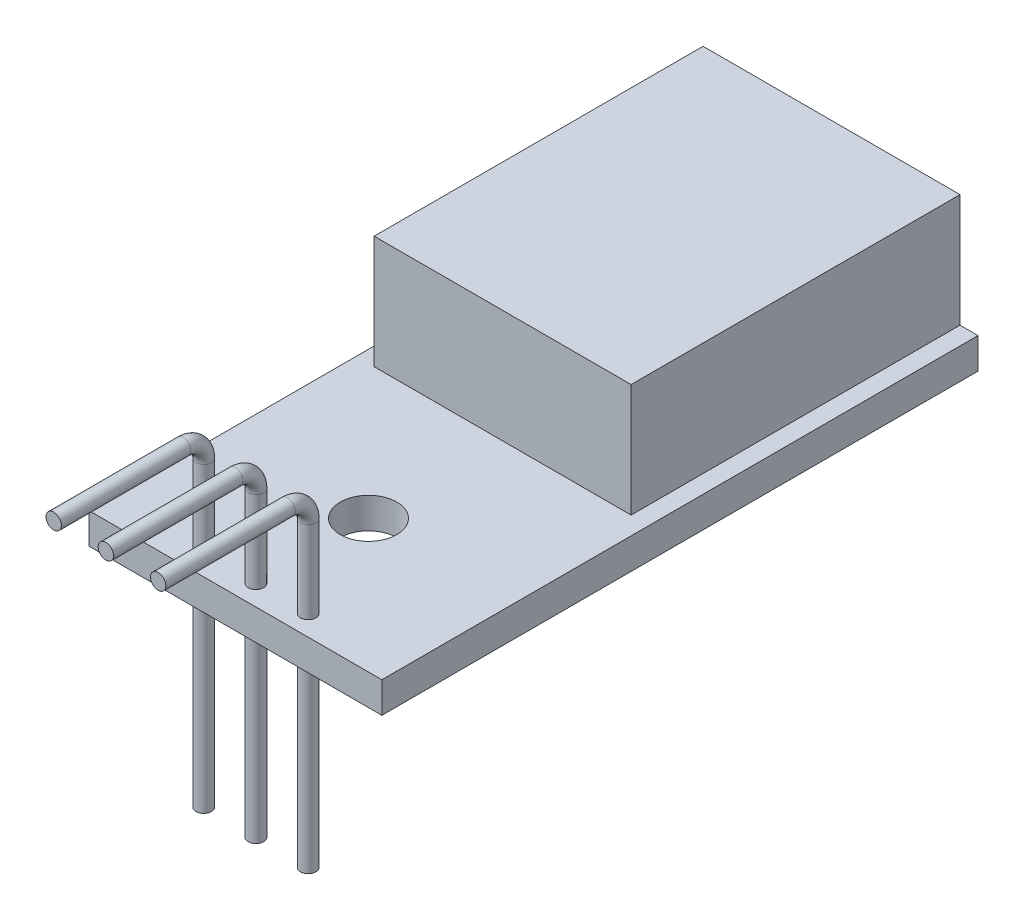
ISO-10303-21;
HEADER;
FILE_DESCRIPTION(('STEP AP214'),'2;1');
FILE_NAME('part.step','',(''),(''),'','','');
FILE_SCHEMA(('AUTOMOTIVE_DESIGN { 1 0 10303 214 1 1 1 1 }'));
ENDSEC;
DATA;
#1=APPLICATION_CONTEXT('core data for automotive mechanical design processes');
#2=APPLICATION_PROTOCOL_DEFINITION('international standard','automotive_design',2000,#1);
#3=PRODUCT_CONTEXT('',#1,'mechanical');
#4=PRODUCT('Part','Part','',(#3));
#5=PRODUCT_RELATED_PRODUCT_CATEGORY('part','',(#4));
#6=PRODUCT_DEFINITION_FORMATION('','',#4);
#7=PRODUCT_DEFINITION_CONTEXT('part definition',#1,'design');
#8=PRODUCT_DEFINITION('design','',#6,#7);
#9=PRODUCT_DEFINITION_SHAPE('','',#8);
#10=(LENGTH_UNIT() NAMED_UNIT(*) SI_UNIT(.MILLI.,.METRE.));
#11=(NAMED_UNIT(*) PLANE_ANGLE_UNIT() SI_UNIT($,.RADIAN.));
#12=(NAMED_UNIT(*) SI_UNIT($,.STERADIAN.) SOLID_ANGLE_UNIT());
#13=UNCERTAINTY_MEASURE_WITH_UNIT(LENGTH_MEASURE(1.E-05),#10,'distance_accuracy_value','');
#14=(GEOMETRIC_REPRESENTATION_CONTEXT(3) GLOBAL_UNCERTAINTY_ASSIGNED_CONTEXT((#13)) GLOBAL_UNIT_ASSIGNED_CONTEXT((#10,
#11,#12)) REPRESENTATION_CONTEXT('',''));
#15=CARTESIAN_POINT('',(0.,0.,0.));
#16=DIRECTION('',(0.,0.,1.));
#17=DIRECTION('',(1.,0.,0.));
#18=AXIS2_PLACEMENT_3D('',#15,#16,#17);
#19=CARTESIAN_POINT('',(0.,1.5,0.));
#20=DIRECTION('',(0.,-1.,0.));
#21=DIRECTION('',(0.,0.,-1.));
#22=AXIS2_PLACEMENT_3D('',#19,#20,#21);
#23=PLANE('',#22);
#24=CARTESIAN_POINT('',(-2.54,1.5,13.5));
#25=DIRECTION('',(0.,-1.,0.));
#26=DIRECTION('',(0.,0.,-1.));
#27=AXIS2_PLACEMENT_3D('',#24,#25,#26);
#28=CIRCLE('',#27,0.375);
#29=CARTESIAN_POINT('',(-2.54,1.5,13.125));
#30=VERTEX_POINT('',#29);
#31=EDGE_CURVE('E333',#30,#30,#28,.T.);
#32=ORIENTED_EDGE('',*,*,#31,.T.);
#33=EDGE_LOOP('',(#32));
#34=FACE_BOUND('',#33,.T.);
#35=CARTESIAN_POINT('',(2.54,1.5,13.5));
#36=DIRECTION('',(0.,-1.,0.));
#37=DIRECTION('',(0.,0.,-1.));
#38=AXIS2_PLACEMENT_3D('',#35,#36,#37);
#39=CIRCLE('',#38,0.375);
#40=CARTESIAN_POINT('',(2.54,1.5,13.125));
#41=VERTEX_POINT('',#40);
#42=EDGE_CURVE('E255',#41,#41,#39,.T.);
#43=ORIENTED_EDGE('',*,*,#42,.T.);
#44=EDGE_LOOP('',(#43));
#45=FACE_BOUND('',#44,.T.);
#46=CARTESIAN_POINT('',(0.,1.5,13.5));
#47=DIRECTION('',(0.,-1.,0.));
#48=DIRECTION('',(0.,0.,-1.));
#49=AXIS2_PLACEMENT_3D('',#46,#47,#48);
#50=CIRCLE('',#49,0.375);
#51=CARTESIAN_POINT('',(0.,1.5,13.125));
#52=VERTEX_POINT('',#51);
#53=EDGE_CURVE('E135',#52,#52,#50,.T.);
#54=ORIENTED_EDGE('',*,*,#53,.T.);
#55=EDGE_LOOP('',(#54));
#56=FACE_BOUND('',#55,.T.);
#57=CARTESIAN_POINT('',(0.,1.5,8.02500000000001));
#58=DIRECTION('',(0.,1.,0.));
#59=DIRECTION('',(0.,0.,1.));
#60=AXIS2_PLACEMENT_3D('',#57,#58,#59);
#61=CIRCLE('',#60,1.375);
#62=CARTESIAN_POINT('',(0.,1.5,9.40000000000001));
#63=VERTEX_POINT('',#62);
#64=EDGE_CURVE('E124',#63,#63,#61,.T.);
#65=ORIENTED_EDGE('',*,*,#64,.F.);
#66=EDGE_LOOP('',(#65));
#67=FACE_BOUND('',#66,.T.);
#68=DIRECTION('',(0.,0.,-1.));
#69=VECTOR('',#68,1.);
#70=CARTESIAN_POINT('',(6.25,1.5,1.5));
#71=LINE('',#70,#69);
#72=CARTESIAN_POINT('',(6.25,1.5,1.5));
#73=VERTEX_POINT('',#72);
#74=CARTESIAN_POINT('',(6.25,1.5,-14.5));
#75=VERTEX_POINT('',#74);
#76=EDGE_CURVE('E50',#73,#75,#71,.T.);
#77=ORIENTED_EDGE('',*,*,#76,.F.);
#78=DIRECTION('',(1.,0.,0.));
#79=VECTOR('',#78,1.);
#80=CARTESIAN_POINT('',(-6.25,1.5,1.5));
#81=LINE('',#80,#79);
#82=CARTESIAN_POINT('',(-6.25,1.5,1.5));
#83=VERTEX_POINT('',#82);
#84=EDGE_CURVE('E118',#83,#73,#81,.T.);
#85=ORIENTED_EDGE('',*,*,#84,.F.);
#86=DIRECTION('',(0.,0.,1.));
#87=VECTOR('',#86,1.);
#88=CARTESIAN_POINT('',(-6.25,1.5,1.5));
#89=LINE('',#88,#87);
#90=CARTESIAN_POINT('',(-6.25,1.5,-14.5));
#91=VERTEX_POINT('',#90);
#92=EDGE_CURVE('E56',#91,#83,#89,.T.);
#93=ORIENTED_EDGE('',*,*,#92,.F.);
#94=DIRECTION('',(-1.,0.,0.));
#95=VECTOR('',#94,1.);
#96=CARTESIAN_POINT('',(-7.125,1.5,-14.5));
#97=LINE('',#96,#95);
#98=CARTESIAN_POINT('',(-7.125,1.5,-14.5));
#99=VERTEX_POINT('',#98);
#100=EDGE_CURVE('E153',#91,#99,#97,.T.);
#101=ORIENTED_EDGE('',*,*,#100,.T.);
#102=DIRECTION('',(0.,0.,1.));
#103=VECTOR('',#102,1.);
#104=CARTESIAN_POINT('',(-7.125,1.5,14.5));
#105=LINE('',#104,#103);
#106=CARTESIAN_POINT('',(-7.125,1.5,14.5));
#107=VERTEX_POINT('',#106);
#108=EDGE_CURVE('E157',#99,#107,#105,.T.);
#109=ORIENTED_EDGE('',*,*,#108,.T.);
#110=DIRECTION('',(1.,0.,0.));
#111=VECTOR('',#110,1.);
#112=CARTESIAN_POINT('',(-7.125,1.5,14.5));
#113=LINE('',#112,#111);
#114=CARTESIAN_POINT('',(7.125,1.5,14.5));
#115=VERTEX_POINT('',#114);
#116=EDGE_CURVE('E177',#107,#115,#113,.T.);
#117=ORIENTED_EDGE('',*,*,#116,.T.);
#118=DIRECTION('',(0.,0.,-1.));
#119=VECTOR('',#118,1.);
#120=CARTESIAN_POINT('',(7.125,1.5,14.5));
#121=LINE('',#120,#119);
#122=CARTESIAN_POINT('',(7.125,1.5,-14.5));
#123=VERTEX_POINT('',#122);
#124=EDGE_CURVE('E150',#115,#123,#121,.T.);
#125=ORIENTED_EDGE('',*,*,#124,.T.);
#126=EDGE_CURVE('E163',#123,#75,#97,.T.);
#127=ORIENTED_EDGE('',*,*,#126,.T.);
#128=EDGE_LOOP('',(#77,#85,#93,#101,#109,#117,#125,#127));
#129=FACE_BOUND('',#128,.T.);
#130=ADVANCED_FACE('F33',(#34,#45,#56,#67,#129),#23,.F.);
#131=CARTESIAN_POINT('',(0.,0.,0.));
#132=DIRECTION('',(0.,-1.,0.));
#133=DIRECTION('',(0.,0.,-1.));
#134=AXIS2_PLACEMENT_3D('',#131,#132,#133);
#135=PLANE('',#134);
#136=CARTESIAN_POINT('',(-2.54,0.,13.5));
#137=DIRECTION('',(0.,-1.,0.));
#138=DIRECTION('',(0.,0.,-1.));
#139=AXIS2_PLACEMENT_3D('',#136,#137,#138);
#140=CIRCLE('',#139,0.375);
#141=CARTESIAN_POINT('',(-2.54,0.,13.125));
#142=VERTEX_POINT('',#141);
#143=EDGE_CURVE('E12',#142,#142,#140,.T.);
#144=ORIENTED_EDGE('',*,*,#143,.F.);
#145=EDGE_LOOP('',(#144));
#146=FACE_BOUND('',#145,.T.);
#147=CARTESIAN_POINT('',(2.54,0.,13.5));
#148=DIRECTION('',(0.,-1.,0.));
#149=DIRECTION('',(0.,0.,-1.));
#150=AXIS2_PLACEMENT_3D('',#147,#148,#149);
#151=CIRCLE('',#150,0.375);
#152=CARTESIAN_POINT('',(2.54,0.,13.125));
#153=VERTEX_POINT('',#152);
#154=EDGE_CURVE('E42',#153,#153,#151,.T.);
#155=ORIENTED_EDGE('',*,*,#154,.F.);
#156=EDGE_LOOP('',(#155));
#157=FACE_BOUND('',#156,.T.);
#158=CARTESIAN_POINT('',(0.,0.,13.5));
#159=DIRECTION('',(0.,-1.,0.));
#160=DIRECTION('',(0.,0.,-1.));
#161=AXIS2_PLACEMENT_3D('',#158,#159,#160);
#162=CIRCLE('',#161,0.375);
#163=CARTESIAN_POINT('',(0.,0.,13.125));
#164=VERTEX_POINT('',#163);
#165=EDGE_CURVE('E136',#164,#164,#162,.T.);
#166=ORIENTED_EDGE('',*,*,#165,.F.);
#167=EDGE_LOOP('',(#166));
#168=FACE_BOUND('',#167,.T.);
#169=DIRECTION('',(0.,0.,-1.));
#170=VECTOR('',#169,1.);
#171=CARTESIAN_POINT('',(7.125,0.,14.5));
#172=LINE('',#171,#170);
#173=CARTESIAN_POINT('',(7.125,0.,14.5));
#174=VERTEX_POINT('',#173);
#175=CARTESIAN_POINT('',(7.125,0.,-14.5));
#176=VERTEX_POINT('',#175);
#177=EDGE_CURVE('E148',#174,#176,#172,.T.);
#178=ORIENTED_EDGE('',*,*,#177,.F.);
#179=DIRECTION('',(1.,0.,0.));
#180=VECTOR('',#179,1.);
#181=CARTESIAN_POINT('',(-7.125,0.,14.5));
#182=LINE('',#181,#180);
#183=CARTESIAN_POINT('',(-7.125,0.,14.5));
#184=VERTEX_POINT('',#183);
#185=EDGE_CURVE('E154',#184,#174,#182,.T.);
#186=ORIENTED_EDGE('',*,*,#185,.F.);
#187=DIRECTION('',(0.,0.,1.));
#188=VECTOR('',#187,1.);
#189=CARTESIAN_POINT('',(-7.125,0.,14.5));
#190=LINE('',#189,#188);
#191=CARTESIAN_POINT('',(-7.125,0.,-14.5));
#192=VERTEX_POINT('',#191);
#193=EDGE_CURVE('E179',#192,#184,#190,.T.);
#194=ORIENTED_EDGE('',*,*,#193,.F.);
#195=DIRECTION('',(-1.,0.,0.));
#196=VECTOR('',#195,1.);
#197=CARTESIAN_POINT('',(-7.125,0.,-14.5));
#198=LINE('',#197,#196);
#199=EDGE_CURVE('E181',#176,#192,#198,.T.);
#200=ORIENTED_EDGE('',*,*,#199,.F.);
#201=EDGE_LOOP('',(#178,#186,#194,#200));
#202=FACE_BOUND('',#201,.T.);
#203=CARTESIAN_POINT('',(0.,0.,8.02500000000001));
#204=DIRECTION('',(0.,1.,0.));
#205=DIRECTION('',(0.,0.,1.));
#206=AXIS2_PLACEMENT_3D('',#203,#204,#205);
#207=CIRCLE('',#206,1.375);
#208=CARTESIAN_POINT('',(0.,0.,9.40000000000001));
#209=VERTEX_POINT('',#208);
#210=EDGE_CURVE('E121',#209,#209,#207,.T.);
#211=ORIENTED_EDGE('',*,*,#210,.T.);
#212=EDGE_LOOP('',(#211));
#213=FACE_BOUND('',#212,.T.);
#214=ADVANCED_FACE('F201',(#146,#157,#168,#202,#213),#135,.T.);
#215=CARTESIAN_POINT('',(7.125,1.5,14.5));
#216=DIRECTION('',(-1.,0.,0.));
#217=DIRECTION('',(0.,0.,1.));
#218=AXIS2_PLACEMENT_3D('',#215,#216,#217);
#219=PLANE('',#218);
#220=ORIENTED_EDGE('',*,*,#177,.T.);
#221=DIRECTION('',(0.,-1.,0.));
#222=VECTOR('',#221,1.);
#223=CARTESIAN_POINT('',(7.125,1.5,-14.5));
#224=LINE('',#223,#222);
#225=EDGE_CURVE('E165',#123,#176,#224,.T.);
#226=ORIENTED_EDGE('',*,*,#225,.F.);
#227=ORIENTED_EDGE('',*,*,#124,.F.);
#228=DIRECTION('',(0.,-1.,0.));
#229=VECTOR('',#228,1.);
#230=CARTESIAN_POINT('',(7.125,1.5,14.5));
#231=LINE('',#230,#229);
#232=EDGE_CURVE('E174',#115,#174,#231,.T.);
#233=ORIENTED_EDGE('',*,*,#232,.T.);
#234=EDGE_LOOP('',(#220,#226,#227,#233));
#235=FACE_BOUND('',#234,.T.);
#236=ADVANCED_FACE('F199',(#235),#219,.F.);
#237=CARTESIAN_POINT('',(-7.125,1.5,-14.5));
#238=DIRECTION('',(0.,0.,1.));
#239=DIRECTION('',(1.,0.,0.));
#240=AXIS2_PLACEMENT_3D('',#237,#238,#239);
#241=PLANE('',#240);
#242=ORIENTED_EDGE('',*,*,#199,.T.);
#243=DIRECTION('',(0.,-1.,0.));
#244=VECTOR('',#243,1.);
#245=CARTESIAN_POINT('',(-7.125,1.5,-14.5));
#246=LINE('',#245,#244);
#247=EDGE_CURVE('E168',#99,#192,#246,.T.);
#248=ORIENTED_EDGE('',*,*,#247,.F.);
#249=ORIENTED_EDGE('',*,*,#100,.F.);
#250=DIRECTION('',(0.,-1.,0.));
#251=VECTOR('',#250,1.);
#252=CARTESIAN_POINT('',(-6.25,7.,-14.5));
#253=LINE('',#252,#251);
#254=CARTESIAN_POINT('',(-6.25,7.,-14.5));
#255=VERTEX_POINT('',#254);
#256=EDGE_CURVE('E105',#255,#91,#253,.T.);
#257=ORIENTED_EDGE('',*,*,#256,.F.);
#258=DIRECTION('',(-1.,0.,0.));
#259=VECTOR('',#258,1.);
#260=CARTESIAN_POINT('',(-6.25,7.,-14.5));
#261=LINE('',#260,#259);
#262=CARTESIAN_POINT('',(6.25,7.,-14.5));
#263=VERTEX_POINT('',#262);
#264=EDGE_CURVE('E99',#263,#255,#261,.T.);
#265=ORIENTED_EDGE('',*,*,#264,.F.);
#266=DIRECTION('',(0.,-1.,0.));
#267=VECTOR('',#266,1.);
#268=CARTESIAN_POINT('',(6.25,7.,-14.5));
#269=LINE('',#268,#267);
#270=EDGE_CURVE('E103',#263,#75,#269,.T.);
#271=ORIENTED_EDGE('',*,*,#270,.T.);
#272=ORIENTED_EDGE('',*,*,#126,.F.);
#273=ORIENTED_EDGE('',*,*,#225,.T.);
#274=EDGE_LOOP('',(#242,#248,#249,#257,#265,#271,#272,#273));
#275=FACE_BOUND('',#274,.T.);
#276=ADVANCED_FACE('F101',(#275),#241,.F.);
#277=CARTESIAN_POINT('',(-7.125,1.5,14.5));
#278=DIRECTION('',(1.,0.,0.));
#279=DIRECTION('',(0.,0.,-1.));
#280=AXIS2_PLACEMENT_3D('',#277,#278,#279);
#281=PLANE('',#280);
#282=ORIENTED_EDGE('',*,*,#193,.T.);
#283=DIRECTION('',(0.,-1.,0.));
#284=VECTOR('',#283,1.);
#285=CARTESIAN_POINT('',(-7.125,1.5,14.5));
#286=LINE('',#285,#284);
#287=EDGE_CURVE('E171',#107,#184,#286,.T.);
#288=ORIENTED_EDGE('',*,*,#287,.F.);
#289=ORIENTED_EDGE('',*,*,#108,.F.);
#290=ORIENTED_EDGE('',*,*,#247,.T.);
#291=EDGE_LOOP('',(#282,#288,#289,#290));
#292=FACE_BOUND('',#291,.T.);
#293=ADVANCED_FACE('F190',(#292),#281,.F.);
#294=CARTESIAN_POINT('',(-7.125,1.5,14.5));
#295=DIRECTION('',(0.,0.,-1.));
#296=DIRECTION('',(-1.,0.,0.));
#297=AXIS2_PLACEMENT_3D('',#294,#295,#296);
#298=PLANE('',#297);
#299=ORIENTED_EDGE('',*,*,#185,.T.);
#300=ORIENTED_EDGE('',*,*,#232,.F.);
#301=ORIENTED_EDGE('',*,*,#116,.F.);
#302=ORIENTED_EDGE('',*,*,#287,.T.);
#303=EDGE_LOOP('',(#299,#300,#301,#302));
#304=FACE_BOUND('',#303,.T.);
#305=ADVANCED_FACE('F194',(#304),#298,.F.);
#306=CARTESIAN_POINT('',(0.,1.5,8.02500000000001));
#307=DIRECTION('',(0.,-1.,0.));
#308=DIRECTION('',(0.,0.,-1.));
#309=AXIS2_PLACEMENT_3D('',#306,#307,#308);
#310=CYLINDRICAL_SURFACE('',#309,1.375);
#311=ORIENTED_EDGE('',*,*,#64,.T.);
#312=EDGE_LOOP('',(#311));
#313=FACE_BOUND('',#312,.T.);
#314=ORIENTED_EDGE('',*,*,#210,.F.);
#315=EDGE_LOOP('',(#314));
#316=FACE_BOUND('',#315,.T.);
#317=ADVANCED_FACE('F208',(#313,#316),#310,.F.);
#318=CARTESIAN_POINT('',(6.25,7.,1.5));
#319=DIRECTION('',(-1.,0.,0.));
#320=DIRECTION('',(0.,0.,1.));
#321=AXIS2_PLACEMENT_3D('',#318,#319,#320);
#322=PLANE('',#321);
#323=ORIENTED_EDGE('',*,*,#76,.T.);
#324=ORIENTED_EDGE('',*,*,#270,.F.);
#325=DIRECTION('',(0.,0.,-1.));
#326=VECTOR('',#325,1.);
#327=CARTESIAN_POINT('',(6.25,7.,1.5));
#328=LINE('',#327,#326);
#329=CARTESIAN_POINT('',(6.25,7.,1.5));
#330=VERTEX_POINT('',#329);
#331=EDGE_CURVE('E109',#330,#263,#328,.T.);
#332=ORIENTED_EDGE('',*,*,#331,.F.);
#333=DIRECTION('',(0.,-1.,0.));
#334=VECTOR('',#333,1.);
#335=CARTESIAN_POINT('',(6.25,7.,1.5));
#336=LINE('',#335,#334);
#337=EDGE_CURVE('E143',#330,#73,#336,.T.);
#338=ORIENTED_EDGE('',*,*,#337,.T.);
#339=EDGE_LOOP('',(#323,#324,#332,#338));
#340=FACE_BOUND('',#339,.T.);
#341=ADVANCED_FACE('F120',(#340),#322,.F.);
#342=CARTESIAN_POINT('',(-6.25,7.,1.5));
#343=DIRECTION('',(1.,0.,0.));
#344=DIRECTION('',(0.,0.,-1.));
#345=AXIS2_PLACEMENT_3D('',#342,#343,#344);
#346=PLANE('',#345);
#347=ORIENTED_EDGE('',*,*,#92,.T.);
#348=DIRECTION('',(0.,-1.,0.));
#349=VECTOR('',#348,1.);
#350=CARTESIAN_POINT('',(-6.25,7.,1.5));
#351=LINE('',#350,#349);
#352=CARTESIAN_POINT('',(-6.25,7.,1.5));
#353=VERTEX_POINT('',#352);
#354=EDGE_CURVE('E126',#353,#83,#351,.T.);
#355=ORIENTED_EDGE('',*,*,#354,.F.);
#356=DIRECTION('',(0.,0.,1.));
#357=VECTOR('',#356,1.);
#358=CARTESIAN_POINT('',(-6.25,7.,1.5));
#359=LINE('',#358,#357);
#360=EDGE_CURVE('E108',#255,#353,#359,.T.);
#361=ORIENTED_EDGE('',*,*,#360,.F.);
#362=ORIENTED_EDGE('',*,*,#256,.T.);
#363=EDGE_LOOP('',(#347,#355,#361,#362));
#364=FACE_BOUND('',#363,.T.);
#365=ADVANCED_FACE('F216',(#364),#346,.F.);
#366=CARTESIAN_POINT('',(-6.25,7.,1.5));
#367=DIRECTION('',(0.,0.,-1.));
#368=DIRECTION('',(-1.,0.,0.));
#369=AXIS2_PLACEMENT_3D('',#366,#367,#368);
#370=PLANE('',#369);
#371=ORIENTED_EDGE('',*,*,#84,.T.);
#372=ORIENTED_EDGE('',*,*,#337,.F.);
#373=DIRECTION('',(1.,0.,0.));
#374=VECTOR('',#373,1.);
#375=CARTESIAN_POINT('',(-6.25,7.,1.5));
#376=LINE('',#375,#374);
#377=EDGE_CURVE('E114',#353,#330,#376,.T.);
#378=ORIENTED_EDGE('',*,*,#377,.F.);
#379=ORIENTED_EDGE('',*,*,#354,.T.);
#380=EDGE_LOOP('',(#371,#372,#378,#379));
#381=FACE_BOUND('',#380,.T.);
#382=ADVANCED_FACE('F249',(#381),#370,.F.);
#383=CARTESIAN_POINT('',(0.,7.,0.));
#384=DIRECTION('',(0.,-1.,0.));
#385=DIRECTION('',(0.,0.,-1.));
#386=AXIS2_PLACEMENT_3D('',#383,#384,#385);
#387=PLANE('',#386);
#388=ORIENTED_EDGE('',*,*,#331,.T.);
#389=ORIENTED_EDGE('',*,*,#264,.T.);
#390=ORIENTED_EDGE('',*,*,#360,.T.);
#391=ORIENTED_EDGE('',*,*,#377,.T.);
#392=EDGE_LOOP('',(#388,#389,#390,#391));
#393=FACE_BOUND('',#392,.T.);
#394=ADVANCED_FACE('F112',(#393),#387,.F.);
#395=CARTESIAN_POINT('',(0.,-9.2,13.5));
#396=DIRECTION('',(0.,-1.,0.));
#397=DIRECTION('',(0.,0.,-1.));
#398=AXIS2_PLACEMENT_3D('',#395,#396,#397);
#399=PLANE('',#398);
#400=CARTESIAN_POINT('',(0.,-9.2,13.5));
#401=DIRECTION('',(0.,-1.,0.));
#402=DIRECTION('',(0.,0.,-1.));
#403=AXIS2_PLACEMENT_3D('',#400,#401,#402);
#404=CIRCLE('',#403,0.375);
#405=CARTESIAN_POINT('',(0.,-9.2,13.125));
#406=VERTEX_POINT('',#405);
#407=EDGE_CURVE('E37',#406,#406,#404,.T.);
#408=ORIENTED_EDGE('',*,*,#407,.T.);
#409=EDGE_LOOP('',(#408));
#410=FACE_BOUND('',#409,.T.);
#411=ADVANCED_FACE('F238',(#410),#399,.T.);
#412=CARTESIAN_POINT('',(0.,5.5,13.5));
#413=DIRECTION('',(0.,-1.,0.));
#414=DIRECTION('',(0.,0.,-1.));
#415=AXIS2_PLACEMENT_3D('',#412,#413,#414);
#416=CYLINDRICAL_SURFACE('',#415,0.375);
#417=ORIENTED_EDGE('',*,*,#165,.T.);
#418=EDGE_LOOP('',(#417));
#419=FACE_BOUND('',#418,.T.);
#420=ORIENTED_EDGE('',*,*,#407,.F.);
#421=EDGE_LOOP('',(#420));
#422=FACE_BOUND('',#421,.T.);
#423=ADVANCED_FACE('F240',(#419,#422),#416,.T.);
#424=CARTESIAN_POINT('',(0.,5.5,13.5));
#425=DIRECTION('',(0.,-1.,0.));
#426=DIRECTION('',(0.,0.,-1.));
#427=AXIS2_PLACEMENT_3D('',#424,#425,#426);
#428=CIRCLE('',#427,0.375);
#429=CARTESIAN_POINT('',(0.,5.5,13.125));
#430=VERTEX_POINT('',#429);
#431=EDGE_CURVE('E254',#430,#430,#428,.T.);
#432=ORIENTED_EDGE('',*,*,#431,.T.);
#433=EDGE_LOOP('',(#432));
#434=FACE_BOUND('',#433,.T.);
#435=ORIENTED_EDGE('',*,*,#53,.F.);
#436=EDGE_LOOP('',(#435));
#437=FACE_BOUND('',#436,.T.);
#438=ADVANCED_FACE('F246',(#434,#437),#416,.T.);
#439=CARTESIAN_POINT('',(0.,6.5,14.5));
#440=DIRECTION('',(0.,0.,1.));
#441=DIRECTION('',(0.,-1.,0.));
#442=AXIS2_PLACEMENT_3D('',#439,#440,#441);
#443=CYLINDRICAL_SURFACE('',#442,0.375);
#444=CARTESIAN_POINT('',(0.,6.5,14.5));
#445=DIRECTION('',(0.,0.,-1.));
#446=DIRECTION('',(0.,1.,0.));
#447=AXIS2_PLACEMENT_3D('',#444,#445,#446);
#448=CIRCLE('',#447,0.375);
#449=CARTESIAN_POINT('',(0.,6.875,14.5));
#450=VERTEX_POINT('',#449);
#451=EDGE_CURVE('E257',#450,#450,#448,.T.);
#452=ORIENTED_EDGE('',*,*,#451,.F.);
#453=EDGE_LOOP('',(#452));
#454=FACE_BOUND('',#453,.T.);
#455=CARTESIAN_POINT('',(0.,6.5,20.8));
#456=DIRECTION('',(0.,0.,-1.));
#457=DIRECTION('',(0.,1.,0.));
#458=AXIS2_PLACEMENT_3D('',#455,#456,#457);
#459=CIRCLE('',#458,0.375);
#460=CARTESIAN_POINT('',(0.,6.875,20.8));
#461=VERTEX_POINT('',#460);
#462=EDGE_CURVE('E270',#461,#461,#459,.T.);
#463=ORIENTED_EDGE('',*,*,#462,.T.);
#464=EDGE_LOOP('',(#463));
#465=FACE_BOUND('',#464,.T.);
#466=ADVANCED_FACE('F284',(#454,#465),#443,.T.);
#467=CARTESIAN_POINT('',(0.,5.5,14.5));
#468=DIRECTION('',(1.,0.,0.));
#469=DIRECTION('',(0.,0.,-1.));
#470=AXIS2_PLACEMENT_3D('',#467,#468,#469);
#471=TOROIDAL_SURFACE('',#470,1.,0.375);
#472=CARTESIAN_POINT('',(0.,5.5,14.5));
#473=DIRECTION('',(1.,0.,0.));
#474=DIRECTION('',(0.,0.,-1.));
#475=AXIS2_PLACEMENT_3D('',#472,#473,#474);
#476=CIRCLE('',#475,1.375);
#477=EDGE_CURVE('',#430,#450,#476,.T.);
#478=ORIENTED_EDGE('',*,*,#431,.F.);
#479=ORIENTED_EDGE('',*,*,#451,.T.);
#480=ORIENTED_EDGE('',*,*,#477,.T.);
#481=ORIENTED_EDGE('',*,*,#477,.F.);
#482=EDGE_LOOP('',(#478,#480,#479,#481));
#483=FACE_BOUND('',#482,.T.);
#484=ADVANCED_FACE('F287',(#483),#471,.T.);
#485=CARTESIAN_POINT('',(0.,6.5,20.8));
#486=DIRECTION('',(0.,0.,-1.));
#487=DIRECTION('',(0.,1.,0.));
#488=AXIS2_PLACEMENT_3D('',#485,#486,#487);
#489=PLANE('',#488);
#490=ORIENTED_EDGE('',*,*,#462,.F.);
#491=EDGE_LOOP('',(#490));
#492=FACE_BOUND('',#491,.T.);
#493=ADVANCED_FACE('F236',(#492),#489,.F.);
#494=CARTESIAN_POINT('',(2.54,-9.2,13.5));
#495=DIRECTION('',(0.,-1.,0.));
#496=DIRECTION('',(0.,0.,-1.));
#497=AXIS2_PLACEMENT_3D('',#494,#495,#496);
#498=PLANE('',#497);
#499=CARTESIAN_POINT('',(2.54,-9.2,13.5));
#500=DIRECTION('',(0.,-1.,0.));
#501=DIRECTION('',(0.,0.,-1.));
#502=AXIS2_PLACEMENT_3D('',#499,#500,#501);
#503=CIRCLE('',#502,0.375);
#504=CARTESIAN_POINT('',(2.54,-9.2,13.125));
#505=VERTEX_POINT('',#504);
#506=EDGE_CURVE('E336',#505,#505,#503,.T.);
#507=ORIENTED_EDGE('',*,*,#506,.T.);
#508=EDGE_LOOP('',(#507));
#509=FACE_BOUND('',#508,.T.);
#510=ADVANCED_FACE('F233',(#509),#498,.T.);
#511=CARTESIAN_POINT('',(2.54,5.5,13.5));
#512=DIRECTION('',(0.,-1.,0.));
#513=DIRECTION('',(0.,0.,-1.));
#514=AXIS2_PLACEMENT_3D('',#511,#512,#513);
#515=CYLINDRICAL_SURFACE('',#514,0.375);
#516=ORIENTED_EDGE('',*,*,#154,.T.);
#517=EDGE_LOOP('',(#516));
#518=FACE_BOUND('',#517,.T.);
#519=ORIENTED_EDGE('',*,*,#506,.F.);
#520=EDGE_LOOP('',(#519));
#521=FACE_BOUND('',#520,.T.);
#522=ADVANCED_FACE('F235',(#518,#521),#515,.T.);
#523=CARTESIAN_POINT('',(2.54,5.5,13.5));
#524=DIRECTION('',(0.,-1.,0.));
#525=DIRECTION('',(0.,0.,-1.));
#526=AXIS2_PLACEMENT_3D('',#523,#524,#525);
#527=CIRCLE('',#526,0.375);
#528=CARTESIAN_POINT('',(2.54,5.5,13.125));
#529=VERTEX_POINT('',#528);
#530=EDGE_CURVE('E343',#529,#529,#527,.T.);
#531=ORIENTED_EDGE('',*,*,#530,.T.);
#532=EDGE_LOOP('',(#531));
#533=FACE_BOUND('',#532,.T.);
#534=ORIENTED_EDGE('',*,*,#42,.F.);
#535=EDGE_LOOP('',(#534));
#536=FACE_BOUND('',#535,.T.);
#537=ADVANCED_FACE('F299',(#533,#536),#515,.T.);
#538=CARTESIAN_POINT('',(2.54,6.5,14.5));
#539=DIRECTION('',(0.,0.,1.));
#540=DIRECTION('',(0.,-1.,0.));
#541=AXIS2_PLACEMENT_3D('',#538,#539,#540);
#542=CYLINDRICAL_SURFACE('',#541,0.375);
#543=CARTESIAN_POINT('',(2.54,6.5,14.5));
#544=DIRECTION('',(0.,0.,-1.));
#545=DIRECTION('',(0.,1.,0.));
#546=AXIS2_PLACEMENT_3D('',#543,#544,#545);
#547=CIRCLE('',#546,0.375);
#548=CARTESIAN_POINT('',(2.54,6.875,14.5));
#549=VERTEX_POINT('',#548);
#550=EDGE_CURVE('E264',#549,#549,#547,.T.);
#551=ORIENTED_EDGE('',*,*,#550,.F.);
#552=EDGE_LOOP('',(#551));
#553=FACE_BOUND('',#552,.T.);
#554=CARTESIAN_POINT('',(2.54,6.5,20.8));
#555=DIRECTION('',(0.,0.,-1.));
#556=DIRECTION('',(0.,1.,0.));
#557=AXIS2_PLACEMENT_3D('',#554,#555,#556);
#558=CIRCLE('',#557,0.375);
#559=CARTESIAN_POINT('',(2.54,6.875,20.8));
#560=VERTEX_POINT('',#559);
#561=EDGE_CURVE('E260',#560,#560,#558,.T.);
#562=ORIENTED_EDGE('',*,*,#561,.T.);
#563=EDGE_LOOP('',(#562));
#564=FACE_BOUND('',#563,.T.);
#565=ADVANCED_FACE('F295',(#553,#564),#542,.T.);
#566=CARTESIAN_POINT('',(2.54,5.5,14.5));
#567=DIRECTION('',(1.,0.,0.));
#568=DIRECTION('',(0.,0.,-1.));
#569=AXIS2_PLACEMENT_3D('',#566,#567,#568);
#570=TOROIDAL_SURFACE('',#569,1.,0.375);
#571=CARTESIAN_POINT('',(2.54,5.5,14.5));
#572=DIRECTION('',(1.,0.,0.));
#573=DIRECTION('',(0.,0.,-1.));
#574=AXIS2_PLACEMENT_3D('',#571,#572,#573);
#575=CIRCLE('',#574,1.375);
#576=EDGE_CURVE('',#529,#549,#575,.T.);
#577=ORIENTED_EDGE('',*,*,#530,.F.);
#578=ORIENTED_EDGE('',*,*,#550,.T.);
#579=ORIENTED_EDGE('',*,*,#576,.T.);
#580=ORIENTED_EDGE('',*,*,#576,.F.);
#581=EDGE_LOOP('',(#577,#579,#578,#580));
#582=FACE_BOUND('',#581,.T.);
#583=ADVANCED_FACE('F298',(#582),#570,.T.);
#584=CARTESIAN_POINT('',(2.54,6.5,20.8));
#585=DIRECTION('',(0.,0.,-1.));
#586=DIRECTION('',(0.,1.,0.));
#587=AXIS2_PLACEMENT_3D('',#584,#585,#586);
#588=PLANE('',#587);
#589=ORIENTED_EDGE('',*,*,#561,.F.);
#590=EDGE_LOOP('',(#589));
#591=FACE_BOUND('',#590,.T.);
#592=ADVANCED_FACE('F303',(#591),#588,.F.);
#593=CARTESIAN_POINT('',(-2.54,-9.2,13.5));
#594=DIRECTION('',(0.,-1.,0.));
#595=DIRECTION('',(0.,0.,-1.));
#596=AXIS2_PLACEMENT_3D('',#593,#594,#595);
#597=PLANE('',#596);
#598=CARTESIAN_POINT('',(-2.54,-9.2,13.5));
#599=DIRECTION('',(0.,-1.,0.));
#600=DIRECTION('',(0.,0.,-1.));
#601=AXIS2_PLACEMENT_3D('',#598,#599,#600);
#602=CIRCLE('',#601,0.375);
#603=CARTESIAN_POINT('',(-2.54,-9.2,13.125));
#604=VERTEX_POINT('',#603);
#605=EDGE_CURVE('E355',#604,#604,#602,.T.);
#606=ORIENTED_EDGE('',*,*,#605,.T.);
#607=EDGE_LOOP('',(#606));
#608=FACE_BOUND('',#607,.T.);
#609=ADVANCED_FACE('F35',(#608),#597,.T.);
#610=CARTESIAN_POINT('',(-2.54,5.5,13.5));
#611=DIRECTION('',(0.,-1.,0.));
#612=DIRECTION('',(0.,0.,-1.));
#613=AXIS2_PLACEMENT_3D('',#610,#611,#612);
#614=CYLINDRICAL_SURFACE('',#613,0.375);
#615=ORIENTED_EDGE('',*,*,#143,.T.);
#616=EDGE_LOOP('',(#615));
#617=FACE_BOUND('',#616,.T.);
#618=ORIENTED_EDGE('',*,*,#605,.F.);
#619=EDGE_LOOP('',(#618));
#620=FACE_BOUND('',#619,.T.);
#621=ADVANCED_FACE('F321',(#617,#620),#614,.T.);
#622=CARTESIAN_POINT('',(-2.54,5.5,13.5));
#623=DIRECTION('',(0.,-1.,0.));
#624=DIRECTION('',(0.,0.,-1.));
#625=AXIS2_PLACEMENT_3D('',#622,#623,#624);
#626=CIRCLE('',#625,0.375);
#627=CARTESIAN_POINT('',(-2.54,5.5,13.125));
#628=VERTEX_POINT('',#627);
#629=EDGE_CURVE('E339',#628,#628,#626,.T.);
#630=ORIENTED_EDGE('',*,*,#629,.T.);
#631=EDGE_LOOP('',(#630));
#632=FACE_BOUND('',#631,.T.);
#633=ORIENTED_EDGE('',*,*,#31,.F.);
#634=EDGE_LOOP('',(#633));
#635=FACE_BOUND('',#634,.T.);
#636=ADVANCED_FACE('F315',(#632,#635),#614,.T.);
#637=CARTESIAN_POINT('',(-2.54,6.5,14.5));
#638=DIRECTION('',(0.,0.,1.));
#639=DIRECTION('',(0.,-1.,0.));
#640=AXIS2_PLACEMENT_3D('',#637,#638,#639);
#641=CYLINDRICAL_SURFACE('',#640,0.375);
#642=CARTESIAN_POINT('',(-2.54,6.5,14.5));
#643=DIRECTION('',(0.,0.,-1.));
#644=DIRECTION('',(0.,1.,0.));
#645=AXIS2_PLACEMENT_3D('',#642,#643,#644);
#646=CIRCLE('',#645,0.375);
#647=CARTESIAN_POINT('',(-2.54,6.875,14.5));
#648=VERTEX_POINT('',#647);
#649=EDGE_CURVE('E334',#648,#648,#646,.T.);
#650=ORIENTED_EDGE('',*,*,#649,.F.);
#651=EDGE_LOOP('',(#650));
#652=FACE_BOUND('',#651,.T.);
#653=CARTESIAN_POINT('',(-2.54,6.5,20.8));
#654=DIRECTION('',(0.,0.,-1.));
#655=DIRECTION('',(0.,1.,0.));
#656=AXIS2_PLACEMENT_3D('',#653,#654,#655);
#657=CIRCLE('',#656,0.375);
#658=CARTESIAN_POINT('',(-2.54,6.875,20.8));
#659=VERTEX_POINT('',#658);
#660=EDGE_CURVE('E331',#659,#659,#657,.T.);
#661=ORIENTED_EDGE('',*,*,#660,.T.);
#662=EDGE_LOOP('',(#661));
#663=FACE_BOUND('',#662,.T.);
#664=ADVANCED_FACE('F311',(#652,#663),#641,.T.);
#665=CARTESIAN_POINT('',(-2.54,5.5,14.5));
#666=DIRECTION('',(1.,0.,0.));
#667=DIRECTION('',(0.,0.,-1.));
#668=AXIS2_PLACEMENT_3D('',#665,#666,#667);
#669=TOROIDAL_SURFACE('',#668,1.,0.375);
#670=CARTESIAN_POINT('',(-2.54,5.5,14.5));
#671=DIRECTION('',(1.,0.,0.));
#672=DIRECTION('',(0.,0.,-1.));
#673=AXIS2_PLACEMENT_3D('',#670,#671,#672);
#674=CIRCLE('',#673,1.375);
#675=EDGE_CURVE('',#628,#648,#674,.T.);
#676=ORIENTED_EDGE('',*,*,#629,.F.);
#677=ORIENTED_EDGE('',*,*,#649,.T.);
#678=ORIENTED_EDGE('',*,*,#675,.T.);
#679=ORIENTED_EDGE('',*,*,#675,.F.);
#680=EDGE_LOOP('',(#676,#678,#677,#679));
#681=FACE_BOUND('',#680,.T.);
#682=ADVANCED_FACE('F314',(#681),#669,.T.);
#683=CARTESIAN_POINT('',(-2.54,6.5,20.8));
#684=DIRECTION('',(0.,0.,-1.));
#685=DIRECTION('',(0.,1.,0.));
#686=AXIS2_PLACEMENT_3D('',#683,#684,#685);
#687=PLANE('',#686);
#688=ORIENTED_EDGE('',*,*,#660,.F.);
#689=EDGE_LOOP('',(#688));
#690=FACE_BOUND('',#689,.T.);
#691=ADVANCED_FACE('F319',(#690),#687,.F.);
#692=CLOSED_SHELL('',(#130,#214,#236,#276,#293,#305,#317,#341,#365,#382,#394,#411,#423,#438,
#466,#484,#493,#510,#522,#537,#565,#583,#592,#609,#621,#636,#664,#682,#691));
#693=MANIFOLD_SOLID_BREP('B2',#692);
#694=ADVANCED_BREP_SHAPE_REPRESENTATION('',(#18,#693),#14);
#695=SHAPE_DEFINITION_REPRESENTATION(#9,#694);
ENDSEC;
END-ISO-10303-21;
